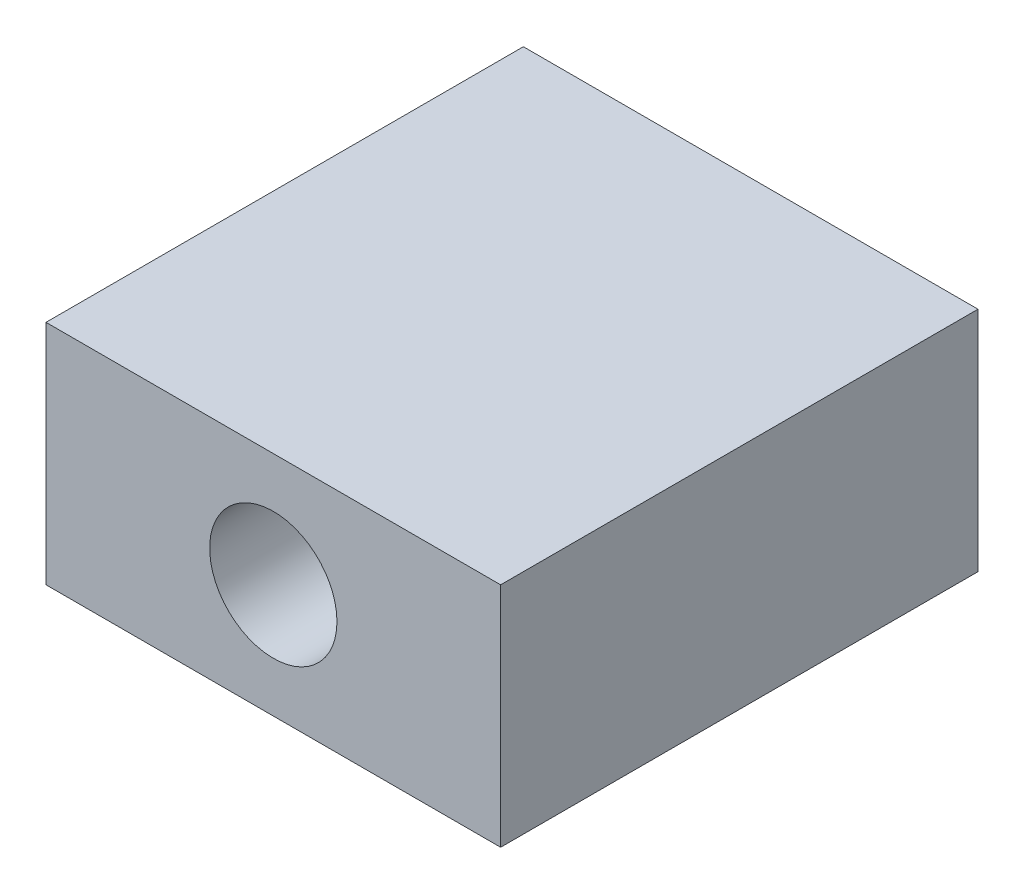
ISO-10303-21;
HEADER;
FILE_DESCRIPTION(('STEP AP214'),'2;1');
FILE_NAME('part.step','',(''),(''),'','','');
FILE_SCHEMA(('AUTOMOTIVE_DESIGN { 1 0 10303 214 1 1 1 1 }'));
ENDSEC;
DATA;
#1=APPLICATION_CONTEXT('core data for automotive mechanical design processes');
#2=APPLICATION_PROTOCOL_DEFINITION('international standard','automotive_design',2000,#1);
#3=PRODUCT_CONTEXT('',#1,'mechanical');
#4=PRODUCT('Part','Part','',(#3));
#5=PRODUCT_RELATED_PRODUCT_CATEGORY('part','',(#4));
#6=PRODUCT_DEFINITION_FORMATION('','',#4);
#7=PRODUCT_DEFINITION_CONTEXT('part definition',#1,'design');
#8=PRODUCT_DEFINITION('design','',#6,#7);
#9=PRODUCT_DEFINITION_SHAPE('','',#8);
#10=(LENGTH_UNIT() NAMED_UNIT(*) SI_UNIT(.MILLI.,.METRE.));
#11=(NAMED_UNIT(*) PLANE_ANGLE_UNIT() SI_UNIT($,.RADIAN.));
#12=(NAMED_UNIT(*) SI_UNIT($,.STERADIAN.) SOLID_ANGLE_UNIT());
#13=UNCERTAINTY_MEASURE_WITH_UNIT(LENGTH_MEASURE(1.E-05),#10,'distance_accuracy_value','');
#14=(GEOMETRIC_REPRESENTATION_CONTEXT(3) GLOBAL_UNCERTAINTY_ASSIGNED_CONTEXT((#13)) GLOBAL_UNIT_ASSIGNED_CONTEXT((#10,
#11,#12)) REPRESENTATION_CONTEXT('',''));
#15=CARTESIAN_POINT('',(0.,0.,0.));
#16=DIRECTION('',(0.,0.,1.));
#17=DIRECTION('',(1.,0.,0.));
#18=AXIS2_PLACEMENT_3D('',#15,#16,#17);
#19=CARTESIAN_POINT('',(0.,31.75,0.));
#20=DIRECTION('',(1.,0.,0.));
#21=DIRECTION('',(0.,0.,-1.));
#22=AXIS2_PLACEMENT_3D('',#19,#20,#21);
#23=PLANE('',#22);
#24=DIRECTION('',(0.,0.,1.));
#25=VECTOR('',#24,1.);
#26=CARTESIAN_POINT('',(0.,0.,0.));
#27=LINE('',#26,#25);
#28=CARTESIAN_POINT('',(0.,0.,-66.675));
#29=VERTEX_POINT('',#28);
#30=CARTESIAN_POINT('',(0.,0.,0.));
#31=VERTEX_POINT('',#30);
#32=EDGE_CURVE('E96',#29,#31,#27,.T.);
#33=ORIENTED_EDGE('',*,*,#32,.T.);
#34=DIRECTION('',(0.,-1.,0.));
#35=VECTOR('',#34,1.);
#36=CARTESIAN_POINT('',(0.,31.75,0.));
#37=LINE('',#36,#35);
#38=CARTESIAN_POINT('',(0.,31.75,0.));
#39=VERTEX_POINT('',#38);
#40=EDGE_CURVE('E11',#39,#31,#37,.T.);
#41=ORIENTED_EDGE('',*,*,#40,.F.);
#42=DIRECTION('',(0.,0.,1.));
#43=VECTOR('',#42,1.);
#44=CARTESIAN_POINT('',(0.,31.75,0.));
#45=LINE('',#44,#43);
#46=CARTESIAN_POINT('',(0.,31.75,-66.675));
#47=VERTEX_POINT('',#46);
#48=EDGE_CURVE('E84',#47,#39,#45,.T.);
#49=ORIENTED_EDGE('',*,*,#48,.F.);
#50=DIRECTION('',(0.,-1.,0.));
#51=VECTOR('',#50,1.);
#52=CARTESIAN_POINT('',(0.,31.75,-66.675));
#53=LINE('',#52,#51);
#54=EDGE_CURVE('E92',#47,#29,#53,.T.);
#55=ORIENTED_EDGE('',*,*,#54,.T.);
#56=EDGE_LOOP('',(#33,#41,#49,#55));
#57=FACE_BOUND('',#56,.T.);
#58=ADVANCED_FACE('F33',(#57),#23,.F.);
#59=CARTESIAN_POINT('',(0.,31.75,0.));
#60=DIRECTION('',(0.,0.,-1.));
#61=DIRECTION('',(-1.,0.,0.));
#62=AXIS2_PLACEMENT_3D('',#59,#60,#61);
#63=PLANE('',#62);
#64=CARTESIAN_POINT('',(31.75,15.875,0.));
#65=DIRECTION('',(0.,0.,1.));
#66=DIRECTION('',(1.,0.,0.));
#67=AXIS2_PLACEMENT_3D('',#64,#65,#66);
#68=CIRCLE('',#67,8.88999999999999);
#69=CARTESIAN_POINT('',(40.64,15.875,0.));
#70=VERTEX_POINT('',#69);
#71=EDGE_CURVE('E110',#70,#70,#68,.T.);
#72=ORIENTED_EDGE('',*,*,#71,.F.);
#73=EDGE_LOOP('',(#72));
#74=FACE_BOUND('',#73,.T.);
#75=DIRECTION('',(1.,0.,0.));
#76=VECTOR('',#75,1.);
#77=CARTESIAN_POINT('',(0.,0.,0.));
#78=LINE('',#77,#76);
#79=CARTESIAN_POINT('',(63.5,0.,0.));
#80=VERTEX_POINT('',#79);
#81=EDGE_CURVE('E88',#31,#80,#78,.T.);
#82=ORIENTED_EDGE('',*,*,#81,.T.);
#83=DIRECTION('',(0.,-1.,0.));
#84=VECTOR('',#83,1.);
#85=CARTESIAN_POINT('',(63.5,31.75,0.));
#86=LINE('',#85,#84);
#87=CARTESIAN_POINT('',(63.5,31.75,0.));
#88=VERTEX_POINT('',#87);
#89=EDGE_CURVE('E41',#88,#80,#86,.T.);
#90=ORIENTED_EDGE('',*,*,#89,.F.);
#91=DIRECTION('',(1.,0.,0.));
#92=VECTOR('',#91,1.);
#93=CARTESIAN_POINT('',(0.,31.75,0.));
#94=LINE('',#93,#92);
#95=EDGE_CURVE('E79',#39,#88,#94,.T.);
#96=ORIENTED_EDGE('',*,*,#95,.F.);
#97=ORIENTED_EDGE('',*,*,#40,.T.);
#98=EDGE_LOOP('',(#82,#90,#96,#97));
#99=FACE_BOUND('',#98,.T.);
#100=ADVANCED_FACE('F87',(#74,#99),#63,.F.);
#101=CARTESIAN_POINT('',(63.5,31.75,0.));
#102=DIRECTION('',(-1.,0.,0.));
#103=DIRECTION('',(0.,0.,1.));
#104=AXIS2_PLACEMENT_3D('',#101,#102,#103);
#105=PLANE('',#104);
#106=DIRECTION('',(0.,0.,-1.));
#107=VECTOR('',#106,1.);
#108=CARTESIAN_POINT('',(63.5,0.,0.));
#109=LINE('',#108,#107);
#110=CARTESIAN_POINT('',(63.5,0.,-66.675));
#111=VERTEX_POINT('',#110);
#112=EDGE_CURVE('E66',#80,#111,#109,.T.);
#113=ORIENTED_EDGE('',*,*,#112,.T.);
#114=DIRECTION('',(0.,-1.,0.));
#115=VECTOR('',#114,1.);
#116=CARTESIAN_POINT('',(63.5,31.75,-66.675));
#117=LINE('',#116,#115);
#118=CARTESIAN_POINT('',(63.5,31.75,-66.675));
#119=VERTEX_POINT('',#118);
#120=EDGE_CURVE('E89',#119,#111,#117,.T.);
#121=ORIENTED_EDGE('',*,*,#120,.F.);
#122=DIRECTION('',(0.,0.,-1.));
#123=VECTOR('',#122,1.);
#124=CARTESIAN_POINT('',(63.5,31.75,0.));
#125=LINE('',#124,#123);
#126=EDGE_CURVE('E82',#88,#119,#125,.T.);
#127=ORIENTED_EDGE('',*,*,#126,.F.);
#128=ORIENTED_EDGE('',*,*,#89,.T.);
#129=EDGE_LOOP('',(#113,#121,#127,#128));
#130=FACE_BOUND('',#129,.T.);
#131=ADVANCED_FACE('F90',(#130),#105,.F.);
#132=CARTESIAN_POINT('',(0.,31.75,-66.675));
#133=DIRECTION('',(0.,0.,1.));
#134=DIRECTION('',(1.,0.,0.));
#135=AXIS2_PLACEMENT_3D('',#132,#133,#134);
#136=PLANE('',#135);
#137=DIRECTION('',(-1.,0.,0.));
#138=VECTOR('',#137,1.);
#139=CARTESIAN_POINT('',(0.,0.,-66.675));
#140=LINE('',#139,#138);
#141=EDGE_CURVE('E72',#111,#29,#140,.T.);
#142=ORIENTED_EDGE('',*,*,#141,.T.);
#143=ORIENTED_EDGE('',*,*,#54,.F.);
#144=DIRECTION('',(-1.,0.,0.));
#145=VECTOR('',#144,1.);
#146=CARTESIAN_POINT('',(0.,31.75,-66.675));
#147=LINE('',#146,#145);
#148=EDGE_CURVE('E49',#119,#47,#147,.T.);
#149=ORIENTED_EDGE('',*,*,#148,.F.);
#150=ORIENTED_EDGE('',*,*,#120,.T.);
#151=EDGE_LOOP('',(#142,#143,#149,#150));
#152=FACE_BOUND('',#151,.T.);
#153=ADVANCED_FACE('F104',(#152),#136,.F.);
#154=CARTESIAN_POINT('',(0.,31.75,0.));
#155=DIRECTION('',(0.,-1.,0.));
#156=DIRECTION('',(0.,0.,-1.));
#157=AXIS2_PLACEMENT_3D('',#154,#155,#156);
#158=PLANE('',#157);
#159=ORIENTED_EDGE('',*,*,#48,.T.);
#160=ORIENTED_EDGE('',*,*,#95,.T.);
#161=ORIENTED_EDGE('',*,*,#126,.T.);
#162=ORIENTED_EDGE('',*,*,#148,.T.);
#163=EDGE_LOOP('',(#159,#160,#161,#162));
#164=FACE_BOUND('',#163,.T.);
#165=ADVANCED_FACE('F80',(#164),#158,.F.);
#166=CARTESIAN_POINT('',(0.,0.,0.));
#167=DIRECTION('',(0.,-1.,0.));
#168=DIRECTION('',(0.,0.,-1.));
#169=AXIS2_PLACEMENT_3D('',#166,#167,#168);
#170=PLANE('',#169);
#171=ORIENTED_EDGE('',*,*,#32,.F.);
#172=ORIENTED_EDGE('',*,*,#141,.F.);
#173=ORIENTED_EDGE('',*,*,#112,.F.);
#174=ORIENTED_EDGE('',*,*,#81,.F.);
#175=EDGE_LOOP('',(#171,#172,#173,#174));
#176=FACE_BOUND('',#175,.T.);
#177=ADVANCED_FACE('F107',(#176),#170,.T.);
#178=CARTESIAN_POINT('',(31.75,15.875,-12.7));
#179=DIRECTION('',(0.,0.,1.));
#180=DIRECTION('',(1.,0.,0.));
#181=AXIS2_PLACEMENT_3D('',#178,#179,#180);
#182=CYLINDRICAL_SURFACE('',#181,8.88999999999999);
#183=CARTESIAN_POINT('',(31.75,15.875,-12.7));
#184=DIRECTION('',(0.,0.,1.));
#185=DIRECTION('',(1.,0.,0.));
#186=AXIS2_PLACEMENT_3D('',#183,#184,#185);
#187=CIRCLE('',#186,8.88999999999999);
#188=CARTESIAN_POINT('',(40.64,15.875,-12.7));
#189=VERTEX_POINT('',#188);
#190=EDGE_CURVE('E99',#189,#189,#187,.T.);
#191=ORIENTED_EDGE('',*,*,#190,.F.);
#192=EDGE_LOOP('',(#191));
#193=FACE_BOUND('',#192,.T.);
#194=ORIENTED_EDGE('',*,*,#71,.T.);
#195=EDGE_LOOP('',(#194));
#196=FACE_BOUND('',#195,.T.);
#197=ADVANCED_FACE('F118',(#193,#196),#182,.F.);
#198=CARTESIAN_POINT('',(31.75,15.875,-12.7));
#199=DIRECTION('',(0.,0.,1.));
#200=DIRECTION('',(1.,0.,0.));
#201=AXIS2_PLACEMENT_3D('',#198,#199,#200);
#202=PLANE('',#201);
#203=ORIENTED_EDGE('',*,*,#190,.T.);
#204=EDGE_LOOP('',(#203));
#205=FACE_BOUND('',#204,.T.);
#206=ADVANCED_FACE('F116',(#205),#202,.T.);
#207=CLOSED_SHELL('',(#58,#100,#131,#153,#165,#177,#197,#206));
#208=MANIFOLD_SOLID_BREP('B2',#207);
#209=ADVANCED_BREP_SHAPE_REPRESENTATION('',(#18,#208),#14);
#210=SHAPE_DEFINITION_REPRESENTATION(#9,#209);
ENDSEC;
END-ISO-10303-21;
